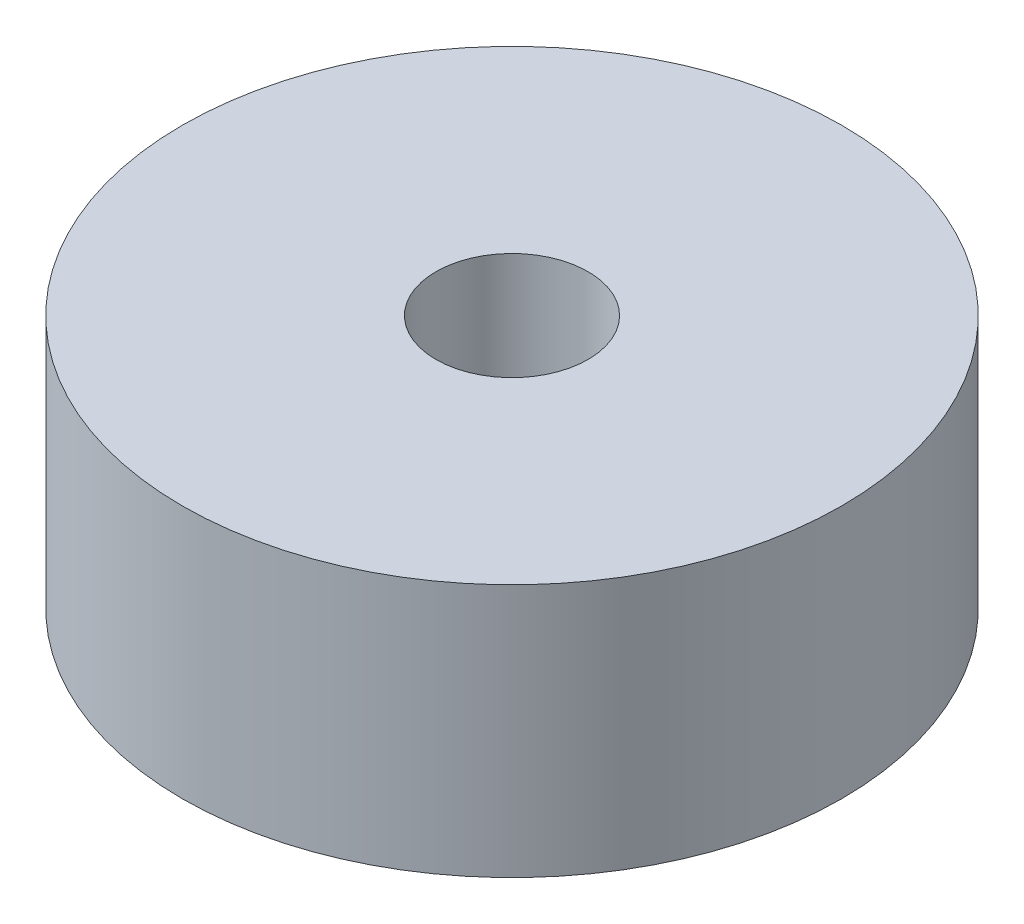
ISO-10303-21;
HEADER;
FILE_DESCRIPTION(('STEP AP214'),'2;1');
FILE_NAME('part.step','',(''),(''),'','','');
FILE_SCHEMA(('AUTOMOTIVE_DESIGN { 1 0 10303 214 1 1 1 1 }'));
ENDSEC;
DATA;
#1=APPLICATION_CONTEXT('core data for automotive mechanical design processes');
#2=APPLICATION_PROTOCOL_DEFINITION('international standard','automotive_design',2000,#1);
#3=PRODUCT_CONTEXT('',#1,'mechanical');
#4=PRODUCT('Part','Part','',(#3));
#5=PRODUCT_RELATED_PRODUCT_CATEGORY('part','',(#4));
#6=PRODUCT_DEFINITION_FORMATION('','',#4);
#7=PRODUCT_DEFINITION_CONTEXT('part definition',#1,'design');
#8=PRODUCT_DEFINITION('design','',#6,#7);
#9=PRODUCT_DEFINITION_SHAPE('','',#8);
#10=(LENGTH_UNIT() NAMED_UNIT(*) SI_UNIT(.MILLI.,.METRE.));
#11=(NAMED_UNIT(*) PLANE_ANGLE_UNIT() SI_UNIT($,.RADIAN.));
#12=(NAMED_UNIT(*) SI_UNIT($,.STERADIAN.) SOLID_ANGLE_UNIT());
#13=UNCERTAINTY_MEASURE_WITH_UNIT(LENGTH_MEASURE(1.E-05),#10,'distance_accuracy_value','');
#14=(GEOMETRIC_REPRESENTATION_CONTEXT(3) GLOBAL_UNCERTAINTY_ASSIGNED_CONTEXT((#13)) GLOBAL_UNIT_ASSIGNED_CONTEXT((#10,
#11,#12)) REPRESENTATION_CONTEXT('',''));
#15=CARTESIAN_POINT('',(0.,0.,0.));
#16=DIRECTION('',(0.,0.,1.));
#17=DIRECTION('',(1.,0.,0.));
#18=AXIS2_PLACEMENT_3D('',#15,#16,#17);
#19=CARTESIAN_POINT('',(0.,5.,0.));
#20=DIRECTION('',(0.,1.,0.));
#21=DIRECTION('',(0.,0.,1.));
#22=AXIS2_PLACEMENT_3D('',#19,#20,#21);
#23=PLANE('',#22);
#24=CARTESIAN_POINT('',(0.,5.,0.));
#25=DIRECTION('',(0.,1.,0.));
#26=DIRECTION('',(0.,0.,1.));
#27=AXIS2_PLACEMENT_3D('',#24,#25,#26);
#28=CIRCLE('',#27,6.5);
#29=CARTESIAN_POINT('',(0.,5.,6.5));
#30=VERTEX_POINT('',#29);
#31=EDGE_CURVE('E10',#30,#30,#28,.T.);
#32=ORIENTED_EDGE('',*,*,#31,.T.);
#33=EDGE_LOOP('',(#32));
#34=FACE_BOUND('',#33,.T.);
#35=CARTESIAN_POINT('',(0.,5.,0.));
#36=DIRECTION('',(0.,1.,0.));
#37=DIRECTION('',(0.,0.,1.));
#38=AXIS2_PLACEMENT_3D('',#35,#36,#37);
#39=CIRCLE('',#38,1.5);
#40=CARTESIAN_POINT('',(0.,5.,1.5));
#41=VERTEX_POINT('',#40);
#42=EDGE_CURVE('E46',#41,#41,#39,.T.);
#43=ORIENTED_EDGE('',*,*,#42,.F.);
#44=EDGE_LOOP('',(#43));
#45=FACE_BOUND('',#44,.T.);
#46=ADVANCED_FACE('F35',(#34,#45),#23,.T.);
#47=CARTESIAN_POINT('',(0.,0.,0.));
#48=DIRECTION('',(0.,1.,0.));
#49=DIRECTION('',(0.,0.,1.));
#50=AXIS2_PLACEMENT_3D('',#47,#48,#49);
#51=PLANE('',#50);
#52=CARTESIAN_POINT('',(0.,0.,0.));
#53=DIRECTION('',(0.,1.,0.));
#54=DIRECTION('',(0.,0.,1.));
#55=AXIS2_PLACEMENT_3D('',#52,#53,#54);
#56=CIRCLE('',#55,6.5);
#57=CARTESIAN_POINT('',(0.,0.,6.5));
#58=VERTEX_POINT('',#57);
#59=EDGE_CURVE('E39',#58,#58,#56,.T.);
#60=ORIENTED_EDGE('',*,*,#59,.F.);
#61=EDGE_LOOP('',(#60));
#62=FACE_BOUND('',#61,.T.);
#63=CARTESIAN_POINT('',(0.,0.,0.));
#64=DIRECTION('',(0.,1.,0.));
#65=DIRECTION('',(0.,0.,1.));
#66=AXIS2_PLACEMENT_3D('',#63,#64,#65);
#67=CIRCLE('',#66,1.5);
#68=CARTESIAN_POINT('',(0.,0.,1.5));
#69=VERTEX_POINT('',#68);
#70=EDGE_CURVE('E48',#69,#69,#67,.T.);
#71=ORIENTED_EDGE('',*,*,#70,.T.);
#72=EDGE_LOOP('',(#71));
#73=FACE_BOUND('',#72,.T.);
#74=ADVANCED_FACE('F58',(#62,#73),#51,.F.);
#75=CARTESIAN_POINT('',(0.,5.,0.));
#76=DIRECTION('',(0.,-1.,0.));
#77=DIRECTION('',(0.,0.,-1.));
#78=AXIS2_PLACEMENT_3D('',#75,#76,#77);
#79=CYLINDRICAL_SURFACE('',#78,6.5);
#80=ORIENTED_EDGE('',*,*,#31,.F.);
#81=EDGE_LOOP('',(#80));
#82=FACE_BOUND('',#81,.T.);
#83=ORIENTED_EDGE('',*,*,#59,.T.);
#84=EDGE_LOOP('',(#83));
#85=FACE_BOUND('',#84,.T.);
#86=ADVANCED_FACE('F37',(#82,#85),#79,.T.);
#87=CARTESIAN_POINT('',(0.,5.,0.));
#88=DIRECTION('',(0.,-1.,0.));
#89=DIRECTION('',(0.,0.,-1.));
#90=AXIS2_PLACEMENT_3D('',#87,#88,#89);
#91=CYLINDRICAL_SURFACE('',#90,1.5);
#92=ORIENTED_EDGE('',*,*,#42,.T.);
#93=EDGE_LOOP('',(#92));
#94=FACE_BOUND('',#93,.T.);
#95=ORIENTED_EDGE('',*,*,#70,.F.);
#96=EDGE_LOOP('',(#95));
#97=FACE_BOUND('',#96,.T.);
#98=ADVANCED_FACE('F54',(#94,#97),#91,.F.);
#99=CLOSED_SHELL('',(#46,#74,#86,#98));
#100=MANIFOLD_SOLID_BREP('B2',#99);
#101=ADVANCED_BREP_SHAPE_REPRESENTATION('',(#18,#100),#14);
#102=SHAPE_DEFINITION_REPRESENTATION(#9,#101);
ENDSEC;
END-ISO-10303-21;
